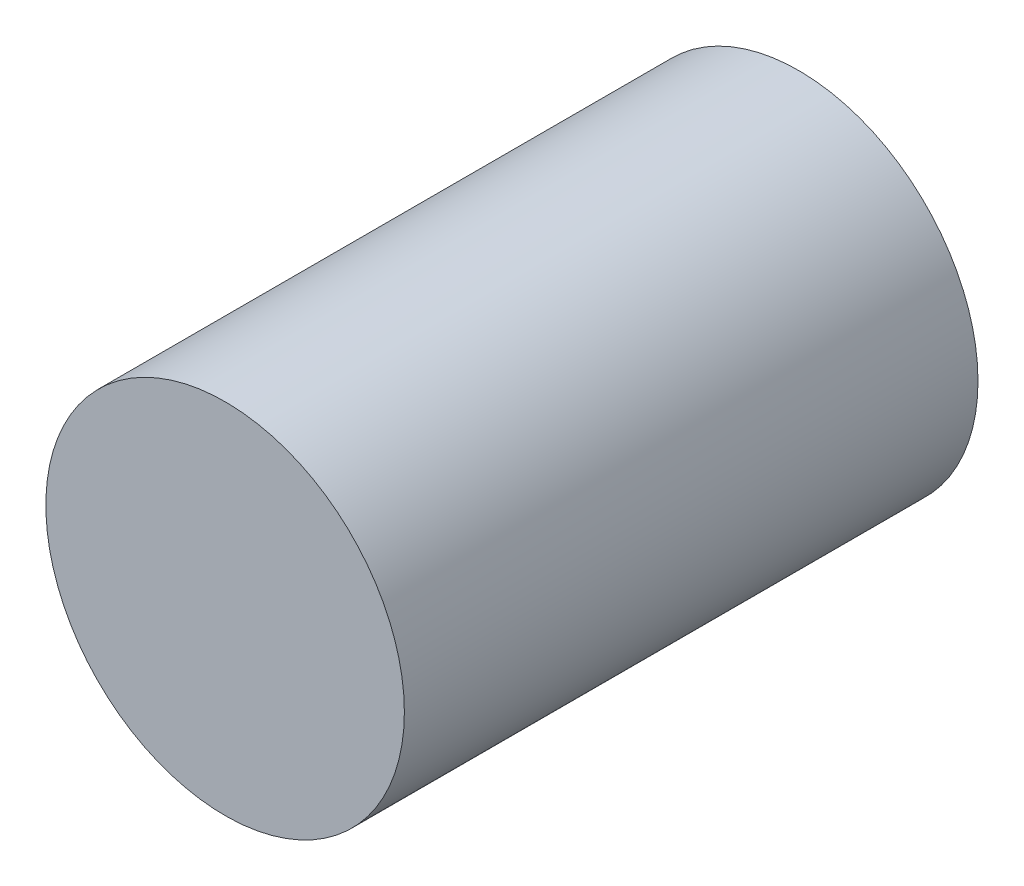
ISO-10303-21;
HEADER;
FILE_DESCRIPTION(('STEP AP214'),'2;1');
FILE_NAME('part.step','',(''),(''),'','','');
FILE_SCHEMA(('AUTOMOTIVE_DESIGN { 1 0 10303 214 1 1 1 1 }'));
ENDSEC;
DATA;
#1=APPLICATION_CONTEXT('core data for automotive mechanical design processes');
#2=APPLICATION_PROTOCOL_DEFINITION('international standard','automotive_design',2000,#1);
#3=PRODUCT_CONTEXT('',#1,'mechanical');
#4=PRODUCT('Part','Part','',(#3));
#5=PRODUCT_RELATED_PRODUCT_CATEGORY('part','',(#4));
#6=PRODUCT_DEFINITION_FORMATION('','',#4);
#7=PRODUCT_DEFINITION_CONTEXT('part definition',#1,'design');
#8=PRODUCT_DEFINITION('design','',#6,#7);
#9=PRODUCT_DEFINITION_SHAPE('','',#8);
#10=(LENGTH_UNIT() NAMED_UNIT(*) SI_UNIT(.MILLI.,.METRE.));
#11=(NAMED_UNIT(*) PLANE_ANGLE_UNIT() SI_UNIT($,.RADIAN.));
#12=(NAMED_UNIT(*) SI_UNIT($,.STERADIAN.) SOLID_ANGLE_UNIT());
#13=UNCERTAINTY_MEASURE_WITH_UNIT(LENGTH_MEASURE(1.E-05),#10,'distance_accuracy_value','');
#14=(GEOMETRIC_REPRESENTATION_CONTEXT(3) GLOBAL_UNCERTAINTY_ASSIGNED_CONTEXT((#13)) GLOBAL_UNIT_ASSIGNED_CONTEXT((#10,
#11,#12)) REPRESENTATION_CONTEXT('',''));
#15=CARTESIAN_POINT('',(0.,0.,0.));
#16=DIRECTION('',(0.,0.,1.));
#17=DIRECTION('',(1.,0.,0.));
#18=AXIS2_PLACEMENT_3D('',#15,#16,#17);
#19=CARTESIAN_POINT('',(0.,0.,8.));
#20=DIRECTION('',(0.,0.,-1.));
#21=DIRECTION('',(-1.,0.,0.));
#22=AXIS2_PLACEMENT_3D('',#19,#20,#21);
#23=CYLINDRICAL_SURFACE('',#22,2.5);
#24=CARTESIAN_POINT('',(0.,0.,8.));
#25=DIRECTION('',(0.,0.,1.));
#26=DIRECTION('',(1.,0.,0.));
#27=AXIS2_PLACEMENT_3D('',#24,#25,#26);
#28=CIRCLE('',#27,2.5);
#29=CARTESIAN_POINT('',(2.5,0.,8.));
#30=VERTEX_POINT('',#29);
#31=EDGE_CURVE('E10',#30,#30,#28,.T.);
#32=ORIENTED_EDGE('',*,*,#31,.F.);
#33=EDGE_LOOP('',(#32));
#34=FACE_BOUND('',#33,.T.);
#35=CARTESIAN_POINT('',(0.,0.,0.));
#36=DIRECTION('',(0.,0.,1.));
#37=DIRECTION('',(1.,0.,0.));
#38=AXIS2_PLACEMENT_3D('',#35,#36,#37);
#39=CIRCLE('',#38,2.5);
#40=CARTESIAN_POINT('',(2.5,0.,0.));
#41=VERTEX_POINT('',#40);
#42=EDGE_CURVE('E40',#41,#41,#39,.T.);
#43=ORIENTED_EDGE('',*,*,#42,.T.);
#44=EDGE_LOOP('',(#43));
#45=FACE_BOUND('',#44,.T.);
#46=ADVANCED_FACE('F37',(#34,#45),#23,.T.);
#47=CARTESIAN_POINT('',(0.,0.,8.));
#48=DIRECTION('',(0.,0.,1.));
#49=DIRECTION('',(1.,0.,0.));
#50=AXIS2_PLACEMENT_3D('',#47,#48,#49);
#51=PLANE('',#50);
#52=ORIENTED_EDGE('',*,*,#31,.T.);
#53=EDGE_LOOP('',(#52));
#54=FACE_BOUND('',#53,.T.);
#55=ADVANCED_FACE('F52',(#54),#51,.T.);
#56=CARTESIAN_POINT('',(0.,0.,0.));
#57=DIRECTION('',(0.,0.,1.));
#58=DIRECTION('',(1.,0.,0.));
#59=AXIS2_PLACEMENT_3D('',#56,#57,#58);
#60=PLANE('',#59);
#61=ORIENTED_EDGE('',*,*,#42,.F.);
#62=EDGE_LOOP('',(#61));
#63=FACE_BOUND('',#62,.T.);
#64=ADVANCED_FACE('F50',(#63),#60,.F.);
#65=CLOSED_SHELL('',(#46,#55,#64));
#66=MANIFOLD_SOLID_BREP('B2',#65);
#67=ADVANCED_BREP_SHAPE_REPRESENTATION('',(#18,#66),#14);
#68=SHAPE_DEFINITION_REPRESENTATION(#9,#67);
ENDSEC;
END-ISO-10303-21;
